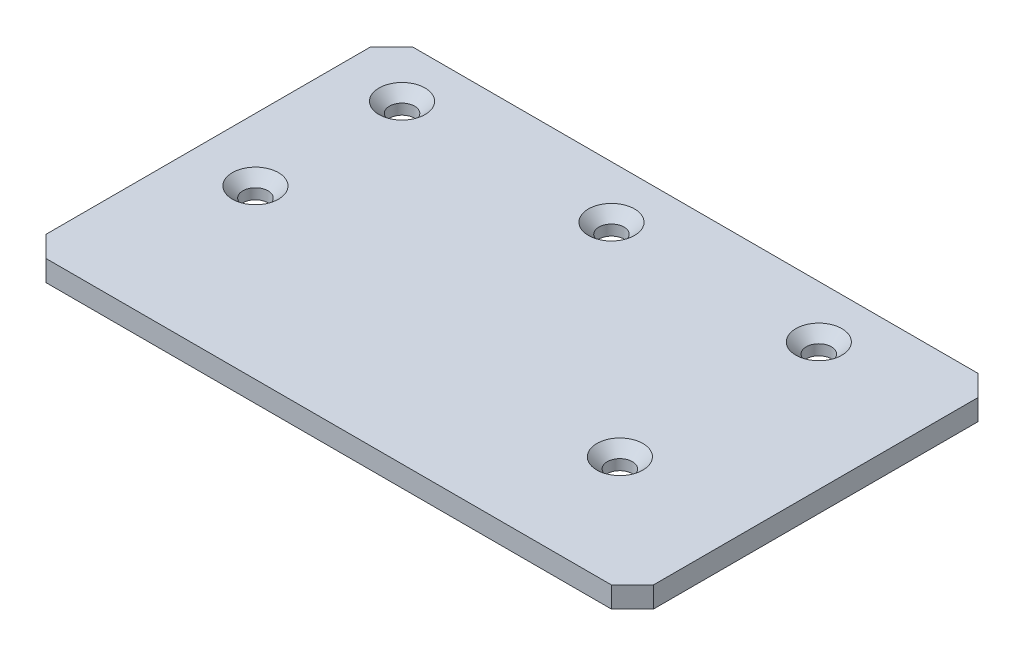
ISO-10303-21;
HEADER;
FILE_DESCRIPTION(('STEP AP214'),'2;1');
FILE_NAME('part.step','',(''),(''),'','','');
FILE_SCHEMA(('AUTOMOTIVE_DESIGN { 1 0 10303 214 1 1 1 1 }'));
ENDSEC;
DATA;
#1=APPLICATION_CONTEXT('core data for automotive mechanical design processes');
#2=APPLICATION_PROTOCOL_DEFINITION('international standard','automotive_design',2000,#1);
#3=PRODUCT_CONTEXT('',#1,'mechanical');
#4=PRODUCT('Part','Part','',(#3));
#5=PRODUCT_RELATED_PRODUCT_CATEGORY('part','',(#4));
#6=PRODUCT_DEFINITION_FORMATION('','',#4);
#7=PRODUCT_DEFINITION_CONTEXT('part definition',#1,'design');
#8=PRODUCT_DEFINITION('design','',#6,#7);
#9=PRODUCT_DEFINITION_SHAPE('','',#8);
#10=(LENGTH_UNIT() NAMED_UNIT(*) SI_UNIT(.MILLI.,.METRE.));
#11=(NAMED_UNIT(*) PLANE_ANGLE_UNIT() SI_UNIT($,.RADIAN.));
#12=(NAMED_UNIT(*) SI_UNIT($,.STERADIAN.) SOLID_ANGLE_UNIT());
#13=UNCERTAINTY_MEASURE_WITH_UNIT(LENGTH_MEASURE(1.E-05),#10,'distance_accuracy_value','');
#14=(GEOMETRIC_REPRESENTATION_CONTEXT(3) GLOBAL_UNCERTAINTY_ASSIGNED_CONTEXT((#13)) GLOBAL_UNIT_ASSIGNED_CONTEXT((#10,
#11,#12)) REPRESENTATION_CONTEXT('',''));
#15=CARTESIAN_POINT('',(0.,0.,0.));
#16=DIRECTION('',(0.,0.,1.));
#17=DIRECTION('',(1.,0.,0.));
#18=AXIS2_PLACEMENT_3D('',#15,#16,#17);
#19=CARTESIAN_POINT('',(29.,2.,17.5));
#20=DIRECTION('',(-1.,0.,0.));
#21=DIRECTION('',(0.,0.,1.));
#22=AXIS2_PLACEMENT_3D('',#19,#20,#21);
#23=PLANE('',#22);
#24=DIRECTION('',(0.,0.,-1.));
#25=VECTOR('',#24,1.);
#26=CARTESIAN_POINT('',(29.,2.,17.5));
#27=LINE('',#26,#25);
#28=CARTESIAN_POINT('',(29.,2.,15.5));
#29=VERTEX_POINT('',#28);
#30=CARTESIAN_POINT('',(29.,2.,-15.5));
#31=VERTEX_POINT('',#30);
#32=EDGE_CURVE('E149',#29,#31,#27,.T.);
#33=ORIENTED_EDGE('',*,*,#32,.F.);
#34=DIRECTION('',(0.,-1.,0.));
#35=VECTOR('',#34,1.);
#36=CARTESIAN_POINT('',(29.,2.,15.5));
#37=LINE('',#36,#35);
#38=CARTESIAN_POINT('',(29.,0.,15.5));
#39=VERTEX_POINT('',#38);
#40=EDGE_CURVE('E11',#29,#39,#37,.T.);
#41=ORIENTED_EDGE('',*,*,#40,.T.);
#42=DIRECTION('',(0.,0.,-1.));
#43=VECTOR('',#42,1.);
#44=CARTESIAN_POINT('',(29.,0.,17.5));
#45=LINE('',#44,#43);
#46=CARTESIAN_POINT('',(29.,0.,-15.5));
#47=VERTEX_POINT('',#46);
#48=EDGE_CURVE('E151',#39,#47,#45,.T.);
#49=ORIENTED_EDGE('',*,*,#48,.T.);
#50=DIRECTION('',(0.,1.,0.));
#51=VECTOR('',#50,1.);
#52=CARTESIAN_POINT('',(29.,2.,-15.5));
#53=LINE('',#52,#51);
#54=EDGE_CURVE('E57',#47,#31,#53,.T.);
#55=ORIENTED_EDGE('',*,*,#54,.T.);
#56=EDGE_LOOP('',(#33,#41,#49,#55));
#57=FACE_BOUND('',#56,.T.);
#58=ADVANCED_FACE('F47',(#57),#23,.F.);
#59=CARTESIAN_POINT('',(-29.,2.,-17.5));
#60=DIRECTION('',(0.,0.,1.));
#61=DIRECTION('',(1.,0.,0.));
#62=AXIS2_PLACEMENT_3D('',#59,#60,#61);
#63=PLANE('',#62);
#64=DIRECTION('',(-1.,0.,0.));
#65=VECTOR('',#64,1.);
#66=CARTESIAN_POINT('',(-29.,0.,-17.5));
#67=LINE('',#66,#65);
#68=CARTESIAN_POINT('',(27.,0.,-17.5));
#69=VERTEX_POINT('',#68);
#70=CARTESIAN_POINT('',(-27.,0.,-17.5));
#71=VERTEX_POINT('',#70);
#72=EDGE_CURVE('E145',#69,#71,#67,.T.);
#73=ORIENTED_EDGE('',*,*,#72,.T.);
#74=DIRECTION('',(0.,1.,0.));
#75=VECTOR('',#74,1.);
#76=CARTESIAN_POINT('',(-27.,2.,-17.5));
#77=LINE('',#76,#75);
#78=CARTESIAN_POINT('',(-27.,2.,-17.5));
#79=VERTEX_POINT('',#78);
#80=EDGE_CURVE('E121',#71,#79,#77,.T.);
#81=ORIENTED_EDGE('',*,*,#80,.T.);
#82=DIRECTION('',(-1.,0.,0.));
#83=VECTOR('',#82,1.);
#84=CARTESIAN_POINT('',(-29.,2.,-17.5));
#85=LINE('',#84,#83);
#86=CARTESIAN_POINT('',(27.,2.,-17.5));
#87=VERTEX_POINT('',#86);
#88=EDGE_CURVE('E201',#87,#79,#85,.T.);
#89=ORIENTED_EDGE('',*,*,#88,.F.);
#90=DIRECTION('',(0.,-1.,0.));
#91=VECTOR('',#90,1.);
#92=CARTESIAN_POINT('',(27.,2.,-17.5));
#93=LINE('',#92,#91);
#94=EDGE_CURVE('E127',#87,#69,#93,.T.);
#95=ORIENTED_EDGE('',*,*,#94,.T.);
#96=EDGE_LOOP('',(#73,#81,#89,#95));
#97=FACE_BOUND('',#96,.T.);
#98=ADVANCED_FACE('F205',(#97),#63,.F.);
#99=CARTESIAN_POINT('',(-29.,2.,17.5));
#100=DIRECTION('',(1.,0.,0.));
#101=DIRECTION('',(0.,0.,-1.));
#102=AXIS2_PLACEMENT_3D('',#99,#100,#101);
#103=PLANE('',#102);
#104=DIRECTION('',(0.,0.,1.));
#105=VECTOR('',#104,1.);
#106=CARTESIAN_POINT('',(-29.,2.,17.5));
#107=LINE('',#106,#105);
#108=CARTESIAN_POINT('',(-29.,2.,-15.5));
#109=VERTEX_POINT('',#108);
#110=CARTESIAN_POINT('',(-29.,2.,15.5));
#111=VERTEX_POINT('',#110);
#112=EDGE_CURVE('E136',#109,#111,#107,.T.);
#113=ORIENTED_EDGE('',*,*,#112,.F.);
#114=DIRECTION('',(0.,-1.,0.));
#115=VECTOR('',#114,1.);
#116=CARTESIAN_POINT('',(-29.,2.,-15.5));
#117=LINE('',#116,#115);
#118=CARTESIAN_POINT('',(-29.,0.,-15.5));
#119=VERTEX_POINT('',#118);
#120=EDGE_CURVE('E120',#109,#119,#117,.T.);
#121=ORIENTED_EDGE('',*,*,#120,.T.);
#122=DIRECTION('',(0.,0.,1.));
#123=VECTOR('',#122,1.);
#124=CARTESIAN_POINT('',(-29.,0.,17.5));
#125=LINE('',#124,#123);
#126=CARTESIAN_POINT('',(-29.,0.,15.5));
#127=VERTEX_POINT('',#126);
#128=EDGE_CURVE('E134',#119,#127,#125,.T.);
#129=ORIENTED_EDGE('',*,*,#128,.T.);
#130=DIRECTION('',(0.,1.,0.));
#131=VECTOR('',#130,1.);
#132=CARTESIAN_POINT('',(-29.,2.,15.5));
#133=LINE('',#132,#131);
#134=EDGE_CURVE('E139',#127,#111,#133,.T.);
#135=ORIENTED_EDGE('',*,*,#134,.T.);
#136=EDGE_LOOP('',(#113,#121,#129,#135));
#137=FACE_BOUND('',#136,.T.);
#138=ADVANCED_FACE('F133',(#137),#103,.F.);
#139=CARTESIAN_POINT('',(-29.,2.,17.5));
#140=DIRECTION('',(0.,0.,-1.));
#141=DIRECTION('',(-1.,0.,0.));
#142=AXIS2_PLACEMENT_3D('',#139,#140,#141);
#143=PLANE('',#142);
#144=DIRECTION('',(1.,0.,0.));
#145=VECTOR('',#144,1.);
#146=CARTESIAN_POINT('',(-29.,2.,17.5));
#147=LINE('',#146,#145);
#148=CARTESIAN_POINT('',(-27.,2.,17.5));
#149=VERTEX_POINT('',#148);
#150=CARTESIAN_POINT('',(27.,2.,17.5));
#151=VERTEX_POINT('',#150);
#152=EDGE_CURVE('E156',#149,#151,#147,.T.);
#153=ORIENTED_EDGE('',*,*,#152,.F.);
#154=DIRECTION('',(0.,-1.,0.));
#155=VECTOR('',#154,1.);
#156=CARTESIAN_POINT('',(-27.,2.,17.5));
#157=LINE('',#156,#155);
#158=CARTESIAN_POINT('',(-27.,0.,17.5));
#159=VERTEX_POINT('',#158);
#160=EDGE_CURVE('E183',#149,#159,#157,.T.);
#161=ORIENTED_EDGE('',*,*,#160,.T.);
#162=DIRECTION('',(1.,0.,0.));
#163=VECTOR('',#162,1.);
#164=CARTESIAN_POINT('',(-29.,0.,17.5));
#165=LINE('',#164,#163);
#166=CARTESIAN_POINT('',(27.,0.,17.5));
#167=VERTEX_POINT('',#166);
#168=EDGE_CURVE('E144',#159,#167,#165,.T.);
#169=ORIENTED_EDGE('',*,*,#168,.T.);
#170=DIRECTION('',(0.,1.,0.));
#171=VECTOR('',#170,1.);
#172=CARTESIAN_POINT('',(27.,2.,17.5));
#173=LINE('',#172,#171);
#174=EDGE_CURVE('E64',#167,#151,#173,.T.);
#175=ORIENTED_EDGE('',*,*,#174,.T.);
#176=EDGE_LOOP('',(#153,#161,#169,#175));
#177=FACE_BOUND('',#176,.T.);
#178=ADVANCED_FACE('F279',(#177),#143,.F.);
#179=CARTESIAN_POINT('',(0.,2.,0.));
#180=DIRECTION('',(0.,-1.,0.));
#181=DIRECTION('',(0.,0.,-1.));
#182=AXIS2_PLACEMENT_3D('',#179,#180,#181);
#183=PLANE('',#182);
#184=CARTESIAN_POINT('',(-23.,2.,-12.5));
#185=DIRECTION('',(0.,1.,0.));
#186=DIRECTION('',(0.,0.,1.));
#187=AXIS2_PLACEMENT_3D('',#184,#185,#186);
#188=CIRCLE('',#187,2.2);
#189=CARTESIAN_POINT('',(-23.,2.,-10.3));
#190=VERTEX_POINT('',#189);
#191=EDGE_CURVE('E270',#190,#190,#188,.T.);
#192=ORIENTED_EDGE('',*,*,#191,.F.);
#193=EDGE_LOOP('',(#192));
#194=FACE_BOUND('',#193,.T.);
#195=CARTESIAN_POINT('',(-3.,2.,-12.5));
#196=DIRECTION('',(0.,1.,0.));
#197=DIRECTION('',(0.,0.,1.));
#198=AXIS2_PLACEMENT_3D('',#195,#196,#197);
#199=CIRCLE('',#198,2.2);
#200=CARTESIAN_POINT('',(-3.,2.,-10.3));
#201=VERTEX_POINT('',#200);
#202=EDGE_CURVE('E258',#201,#201,#199,.T.);
#203=ORIENTED_EDGE('',*,*,#202,.F.);
#204=EDGE_LOOP('',(#203));
#205=FACE_BOUND('',#204,.T.);
#206=CARTESIAN_POINT('',(16.8,2.,-12.5));
#207=DIRECTION('',(0.,1.,0.));
#208=DIRECTION('',(0.,0.,1.));
#209=AXIS2_PLACEMENT_3D('',#206,#207,#208);
#210=CIRCLE('',#209,2.2);
#211=CARTESIAN_POINT('',(16.8,2.,-10.3));
#212=VERTEX_POINT('',#211);
#213=EDGE_CURVE('E246',#212,#212,#210,.T.);
#214=ORIENTED_EDGE('',*,*,#213,.F.);
#215=EDGE_LOOP('',(#214));
#216=FACE_BOUND('',#215,.T.);
#217=CARTESIAN_POINT('',(16.8,2.,6.5));
#218=DIRECTION('',(0.,1.,0.));
#219=DIRECTION('',(0.,0.,1.));
#220=AXIS2_PLACEMENT_3D('',#217,#218,#219);
#221=CIRCLE('',#220,2.2);
#222=CARTESIAN_POINT('',(16.8,2.,8.7));
#223=VERTEX_POINT('',#222);
#224=EDGE_CURVE('E234',#223,#223,#221,.T.);
#225=ORIENTED_EDGE('',*,*,#224,.F.);
#226=EDGE_LOOP('',(#225));
#227=FACE_BOUND('',#226,.T.);
#228=CARTESIAN_POINT('',(-23.,2.,1.5));
#229=DIRECTION('',(0.,1.,0.));
#230=DIRECTION('',(0.,0.,1.));
#231=AXIS2_PLACEMENT_3D('',#228,#229,#230);
#232=CIRCLE('',#231,2.2);
#233=CARTESIAN_POINT('',(-23.,2.,3.7));
#234=VERTEX_POINT('',#233);
#235=EDGE_CURVE('E222',#234,#234,#232,.T.);
#236=ORIENTED_EDGE('',*,*,#235,.F.);
#237=EDGE_LOOP('',(#236));
#238=FACE_BOUND('',#237,.T.);
#239=ORIENTED_EDGE('',*,*,#88,.T.);
#240=DIRECTION('',(0.707106781186549,0.,-0.707106781186546));
#241=VECTOR('',#240,1.);
#242=CARTESIAN_POINT('',(-29.,2.,-15.5));
#243=LINE('',#242,#241);
#244=EDGE_CURVE('E178',#79,#109,#243,.F.);
#245=ORIENTED_EDGE('',*,*,#244,.T.);
#246=ORIENTED_EDGE('',*,*,#112,.T.);
#247=DIRECTION('',(-0.707106781186548,0.,-0.707106781186548));
#248=VECTOR('',#247,1.);
#249=CARTESIAN_POINT('',(-27.,2.,17.5));
#250=LINE('',#249,#248);
#251=EDGE_CURVE('E71',#111,#149,#250,.F.);
#252=ORIENTED_EDGE('',*,*,#251,.T.);
#253=ORIENTED_EDGE('',*,*,#152,.T.);
#254=DIRECTION('',(-0.707106781186549,0.,0.707106781186546));
#255=VECTOR('',#254,1.);
#256=CARTESIAN_POINT('',(29.,2.,15.5));
#257=LINE('',#256,#255);
#258=EDGE_CURVE('E173',#151,#29,#257,.F.);
#259=ORIENTED_EDGE('',*,*,#258,.T.);
#260=ORIENTED_EDGE('',*,*,#32,.T.);
#261=DIRECTION('',(0.707106781186546,0.,0.707106781186549));
#262=VECTOR('',#261,1.);
#263=CARTESIAN_POINT('',(27.,2.,-17.5));
#264=LINE('',#263,#262);
#265=EDGE_CURVE('E170',#31,#87,#264,.F.);
#266=ORIENTED_EDGE('',*,*,#265,.T.);
#267=EDGE_LOOP('',(#239,#245,#246,#252,#253,#259,#260,#266));
#268=FACE_BOUND('',#267,.T.);
#269=ADVANCED_FACE('F197',(#194,#205,#216,#227,#238,#268),#183,.F.);
#270=CARTESIAN_POINT('',(0.,0.,0.));
#271=DIRECTION('',(0.,-1.,0.));
#272=DIRECTION('',(0.,0.,-1.));
#273=AXIS2_PLACEMENT_3D('',#270,#271,#272);
#274=PLANE('',#273);
#275=CARTESIAN_POINT('',(-23.,0.,-12.5));
#276=DIRECTION('',(0.,1.,0.));
#277=DIRECTION('',(0.,0.,1.));
#278=AXIS2_PLACEMENT_3D('',#275,#276,#277);
#279=CIRCLE('',#278,1.2);
#280=CARTESIAN_POINT('',(-23.,0.,-11.3));
#281=VERTEX_POINT('',#280);
#282=EDGE_CURVE('E262',#281,#281,#279,.T.);
#283=ORIENTED_EDGE('',*,*,#282,.T.);
#284=EDGE_LOOP('',(#283));
#285=FACE_BOUND('',#284,.T.);
#286=CARTESIAN_POINT('',(-3.,0.,-12.5));
#287=DIRECTION('',(0.,1.,0.));
#288=DIRECTION('',(0.,0.,1.));
#289=AXIS2_PLACEMENT_3D('',#286,#287,#288);
#290=CIRCLE('',#289,1.2);
#291=CARTESIAN_POINT('',(-3.,0.,-11.3));
#292=VERTEX_POINT('',#291);
#293=EDGE_CURVE('E250',#292,#292,#290,.T.);
#294=ORIENTED_EDGE('',*,*,#293,.T.);
#295=EDGE_LOOP('',(#294));
#296=FACE_BOUND('',#295,.T.);
#297=CARTESIAN_POINT('',(16.8,0.,-12.5));
#298=DIRECTION('',(0.,1.,0.));
#299=DIRECTION('',(0.,0.,1.));
#300=AXIS2_PLACEMENT_3D('',#297,#298,#299);
#301=CIRCLE('',#300,1.2);
#302=CARTESIAN_POINT('',(16.8,0.,-11.3));
#303=VERTEX_POINT('',#302);
#304=EDGE_CURVE('E238',#303,#303,#301,.T.);
#305=ORIENTED_EDGE('',*,*,#304,.T.);
#306=EDGE_LOOP('',(#305));
#307=FACE_BOUND('',#306,.T.);
#308=CARTESIAN_POINT('',(16.8,0.,6.5));
#309=DIRECTION('',(0.,1.,0.));
#310=DIRECTION('',(0.,0.,1.));
#311=AXIS2_PLACEMENT_3D('',#308,#309,#310);
#312=CIRCLE('',#311,1.2);
#313=CARTESIAN_POINT('',(16.8,0.,7.7));
#314=VERTEX_POINT('',#313);
#315=EDGE_CURVE('E226',#314,#314,#312,.T.);
#316=ORIENTED_EDGE('',*,*,#315,.T.);
#317=EDGE_LOOP('',(#316));
#318=FACE_BOUND('',#317,.T.);
#319=CARTESIAN_POINT('',(-23.,0.,1.5));
#320=DIRECTION('',(0.,1.,0.));
#321=DIRECTION('',(0.,0.,1.));
#322=AXIS2_PLACEMENT_3D('',#319,#320,#321);
#323=CIRCLE('',#322,1.2);
#324=CARTESIAN_POINT('',(-23.,0.,2.7));
#325=VERTEX_POINT('',#324);
#326=EDGE_CURVE('E207',#325,#325,#323,.T.);
#327=ORIENTED_EDGE('',*,*,#326,.T.);
#328=EDGE_LOOP('',(#327));
#329=FACE_BOUND('',#328,.T.);
#330=ORIENTED_EDGE('',*,*,#128,.F.);
#331=DIRECTION('',(-0.707106781186549,0.,0.707106781186546));
#332=VECTOR('',#331,1.);
#333=CARTESIAN_POINT('',(-22.2499999999999,0.,-22.25));
#334=LINE('',#333,#332);
#335=EDGE_CURVE('E116',#119,#71,#334,.F.);
#336=ORIENTED_EDGE('',*,*,#335,.T.);
#337=ORIENTED_EDGE('',*,*,#72,.F.);
#338=DIRECTION('',(-0.707106781186546,0.,-0.707106781186549));
#339=VECTOR('',#338,1.);
#340=CARTESIAN_POINT('',(22.25,0.,-22.25));
#341=LINE('',#340,#339);
#342=EDGE_CURVE('E138',#69,#47,#341,.F.);
#343=ORIENTED_EDGE('',*,*,#342,.T.);
#344=ORIENTED_EDGE('',*,*,#48,.F.);
#345=DIRECTION('',(0.707106781186549,0.,-0.707106781186546));
#346=VECTOR('',#345,1.);
#347=CARTESIAN_POINT('',(22.2499999999999,0.,22.25));
#348=LINE('',#347,#346);
#349=EDGE_CURVE('E160',#39,#167,#348,.F.);
#350=ORIENTED_EDGE('',*,*,#349,.T.);
#351=ORIENTED_EDGE('',*,*,#168,.F.);
#352=DIRECTION('',(0.707106781186548,0.,0.707106781186548));
#353=VECTOR('',#352,1.);
#354=CARTESIAN_POINT('',(-22.25,0.,22.25));
#355=LINE('',#354,#353);
#356=EDGE_CURVE('E128',#159,#127,#355,.F.);
#357=ORIENTED_EDGE('',*,*,#356,.T.);
#358=EDGE_LOOP('',(#330,#336,#337,#343,#344,#350,#351,#357));
#359=FACE_BOUND('',#358,.T.);
#360=ADVANCED_FACE('F141',(#285,#296,#307,#318,#329,#359),#274,.T.);
#361=CARTESIAN_POINT('',(-23.,2.,1.5));
#362=DIRECTION('',(0.,1.,0.));
#363=DIRECTION('',(0.,0.,1.));
#364=AXIS2_PLACEMENT_3D('',#361,#362,#363);
#365=CYLINDRICAL_SURFACE('',#364,1.2);
#366=ORIENTED_EDGE('',*,*,#326,.F.);
#367=EDGE_LOOP('',(#366));
#368=FACE_BOUND('',#367,.T.);
#369=CARTESIAN_POINT('',(-23.,0.999999999999999,1.5));
#370=DIRECTION('',(0.,1.,0.));
#371=DIRECTION('',(0.,0.,1.));
#372=AXIS2_PLACEMENT_3D('',#369,#370,#371);
#373=CIRCLE('',#372,1.2);
#374=CARTESIAN_POINT('',(-23.,0.999999999999999,2.7));
#375=VERTEX_POINT('',#374);
#376=EDGE_CURVE('E210',#375,#375,#373,.T.);
#377=ORIENTED_EDGE('',*,*,#376,.T.);
#378=EDGE_LOOP('',(#377));
#379=FACE_BOUND('',#378,.T.);
#380=ADVANCED_FACE('F292',(#368,#379),#365,.F.);
#381=CARTESIAN_POINT('',(-23.,2.,1.5));
#382=DIRECTION('',(0.,1.,0.));
#383=DIRECTION('',(0.,0.,1.));
#384=AXIS2_PLACEMENT_3D('',#381,#382,#383);
#385=CONICAL_SURFACE('',#384,2.2,0.785398163397448);
#386=ORIENTED_EDGE('',*,*,#376,.F.);
#387=EDGE_LOOP('',(#386));
#388=FACE_BOUND('',#387,.T.);
#389=ORIENTED_EDGE('',*,*,#235,.T.);
#390=EDGE_LOOP('',(#389));
#391=FACE_BOUND('',#390,.T.);
#392=ADVANCED_FACE('F289',(#388,#391),#385,.F.);
#393=CARTESIAN_POINT('',(16.8,2.,6.5));
#394=DIRECTION('',(0.,1.,0.));
#395=DIRECTION('',(0.,0.,1.));
#396=AXIS2_PLACEMENT_3D('',#393,#394,#395);
#397=CYLINDRICAL_SURFACE('',#396,1.2);
#398=ORIENTED_EDGE('',*,*,#315,.F.);
#399=EDGE_LOOP('',(#398));
#400=FACE_BOUND('',#399,.T.);
#401=CARTESIAN_POINT('',(16.8,0.999999999999999,6.5));
#402=DIRECTION('',(0.,1.,0.));
#403=DIRECTION('',(0.,0.,1.));
#404=AXIS2_PLACEMENT_3D('',#401,#402,#403);
#405=CIRCLE('',#404,1.2);
#406=CARTESIAN_POINT('',(16.8,0.999999999999999,7.7));
#407=VERTEX_POINT('',#406);
#408=EDGE_CURVE('E230',#407,#407,#405,.T.);
#409=ORIENTED_EDGE('',*,*,#408,.T.);
#410=EDGE_LOOP('',(#409));
#411=FACE_BOUND('',#410,.T.);
#412=ADVANCED_FACE('F291',(#400,#411),#397,.F.);
#413=CARTESIAN_POINT('',(16.8,2.,6.5));
#414=DIRECTION('',(0.,1.,0.));
#415=DIRECTION('',(0.,0.,1.));
#416=AXIS2_PLACEMENT_3D('',#413,#414,#415);
#417=CONICAL_SURFACE('',#416,2.2,0.785398163397448);
#418=ORIENTED_EDGE('',*,*,#408,.F.);
#419=EDGE_LOOP('',(#418));
#420=FACE_BOUND('',#419,.T.);
#421=ORIENTED_EDGE('',*,*,#224,.T.);
#422=EDGE_LOOP('',(#421));
#423=FACE_BOUND('',#422,.T.);
#424=ADVANCED_FACE('F299',(#420,#423),#417,.F.);
#425=CARTESIAN_POINT('',(16.8,2.,-12.5));
#426=DIRECTION('',(0.,1.,0.));
#427=DIRECTION('',(0.,0.,1.));
#428=AXIS2_PLACEMENT_3D('',#425,#426,#427);
#429=CYLINDRICAL_SURFACE('',#428,1.2);
#430=ORIENTED_EDGE('',*,*,#304,.F.);
#431=EDGE_LOOP('',(#430));
#432=FACE_BOUND('',#431,.T.);
#433=CARTESIAN_POINT('',(16.8,0.999999999999999,-12.5));
#434=DIRECTION('',(0.,1.,0.));
#435=DIRECTION('',(0.,0.,1.));
#436=AXIS2_PLACEMENT_3D('',#433,#434,#435);
#437=CIRCLE('',#436,1.2);
#438=CARTESIAN_POINT('',(16.8,0.999999999999999,-11.3));
#439=VERTEX_POINT('',#438);
#440=EDGE_CURVE('E242',#439,#439,#437,.T.);
#441=ORIENTED_EDGE('',*,*,#440,.T.);
#442=EDGE_LOOP('',(#441));
#443=FACE_BOUND('',#442,.T.);
#444=ADVANCED_FACE('F402',(#432,#443),#429,.F.);
#445=CARTESIAN_POINT('',(16.8,2.,-12.5));
#446=DIRECTION('',(0.,1.,0.));
#447=DIRECTION('',(0.,0.,1.));
#448=AXIS2_PLACEMENT_3D('',#445,#446,#447);
#449=CONICAL_SURFACE('',#448,2.2,0.785398163397448);
#450=ORIENTED_EDGE('',*,*,#440,.F.);
#451=EDGE_LOOP('',(#450));
#452=FACE_BOUND('',#451,.T.);
#453=ORIENTED_EDGE('',*,*,#213,.T.);
#454=EDGE_LOOP('',(#453));
#455=FACE_BOUND('',#454,.T.);
#456=ADVANCED_FACE('F392',(#452,#455),#449,.F.);
#457=CARTESIAN_POINT('',(-3.,2.,-12.5));
#458=DIRECTION('',(0.,1.,0.));
#459=DIRECTION('',(0.,0.,1.));
#460=AXIS2_PLACEMENT_3D('',#457,#458,#459);
#461=CYLINDRICAL_SURFACE('',#460,1.2);
#462=ORIENTED_EDGE('',*,*,#293,.F.);
#463=EDGE_LOOP('',(#462));
#464=FACE_BOUND('',#463,.T.);
#465=CARTESIAN_POINT('',(-3.,0.999999999999999,-12.5));
#466=DIRECTION('',(0.,1.,0.));
#467=DIRECTION('',(0.,0.,1.));
#468=AXIS2_PLACEMENT_3D('',#465,#466,#467);
#469=CIRCLE('',#468,1.2);
#470=CARTESIAN_POINT('',(-3.,0.999999999999999,-11.3));
#471=VERTEX_POINT('',#470);
#472=EDGE_CURVE('E254',#471,#471,#469,.T.);
#473=ORIENTED_EDGE('',*,*,#472,.T.);
#474=EDGE_LOOP('',(#473));
#475=FACE_BOUND('',#474,.T.);
#476=ADVANCED_FACE('F382',(#464,#475),#461,.F.);
#477=CARTESIAN_POINT('',(-3.,2.,-12.5));
#478=DIRECTION('',(0.,1.,0.));
#479=DIRECTION('',(0.,0.,1.));
#480=AXIS2_PLACEMENT_3D('',#477,#478,#479);
#481=CONICAL_SURFACE('',#480,2.2,0.785398163397448);
#482=ORIENTED_EDGE('',*,*,#472,.F.);
#483=EDGE_LOOP('',(#482));
#484=FACE_BOUND('',#483,.T.);
#485=ORIENTED_EDGE('',*,*,#202,.T.);
#486=EDGE_LOOP('',(#485));
#487=FACE_BOUND('',#486,.T.);
#488=ADVANCED_FACE('F372',(#484,#487),#481,.F.);
#489=CARTESIAN_POINT('',(-23.,2.,-12.5));
#490=DIRECTION('',(0.,1.,0.));
#491=DIRECTION('',(0.,0.,1.));
#492=AXIS2_PLACEMENT_3D('',#489,#490,#491);
#493=CYLINDRICAL_SURFACE('',#492,1.2);
#494=ORIENTED_EDGE('',*,*,#282,.F.);
#495=EDGE_LOOP('',(#494));
#496=FACE_BOUND('',#495,.T.);
#497=CARTESIAN_POINT('',(-23.,0.999999999999999,-12.5));
#498=DIRECTION('',(0.,1.,0.));
#499=DIRECTION('',(0.,0.,1.));
#500=AXIS2_PLACEMENT_3D('',#497,#498,#499);
#501=CIRCLE('',#500,1.2);
#502=CARTESIAN_POINT('',(-23.,0.999999999999999,-11.3));
#503=VERTEX_POINT('',#502);
#504=EDGE_CURVE('E266',#503,#503,#501,.T.);
#505=ORIENTED_EDGE('',*,*,#504,.T.);
#506=EDGE_LOOP('',(#505));
#507=FACE_BOUND('',#506,.T.);
#508=ADVANCED_FACE('F362',(#496,#507),#493,.F.);
#509=CARTESIAN_POINT('',(-23.,2.,-12.5));
#510=DIRECTION('',(0.,1.,0.));
#511=DIRECTION('',(0.,0.,1.));
#512=AXIS2_PLACEMENT_3D('',#509,#510,#511);
#513=CONICAL_SURFACE('',#512,2.2,0.785398163397448);
#514=ORIENTED_EDGE('',*,*,#504,.F.);
#515=EDGE_LOOP('',(#514));
#516=FACE_BOUND('',#515,.T.);
#517=ORIENTED_EDGE('',*,*,#191,.T.);
#518=EDGE_LOOP('',(#517));
#519=FACE_BOUND('',#518,.T.);
#520=ADVANCED_FACE('F275',(#516,#519),#513,.F.);
#521=CARTESIAN_POINT('',(-29.,2.,-15.5));
#522=DIRECTION('',(0.707106781186546,0.,0.707106781186549));
#523=DIRECTION('',(0.,-1.,0.));
#524=AXIS2_PLACEMENT_3D('',#521,#522,#523);
#525=PLANE('',#524);
#526=ORIENTED_EDGE('',*,*,#244,.F.);
#527=ORIENTED_EDGE('',*,*,#80,.F.);
#528=ORIENTED_EDGE('',*,*,#335,.F.);
#529=ORIENTED_EDGE('',*,*,#120,.F.);
#530=EDGE_LOOP('',(#526,#527,#528,#529));
#531=FACE_BOUND('',#530,.T.);
#532=ADVANCED_FACE('F119',(#531),#525,.F.);
#533=CARTESIAN_POINT('',(-27.,2.,17.5));
#534=DIRECTION('',(0.707106781186547,0.,-0.707106781186547));
#535=DIRECTION('',(0.,-1.,0.));
#536=AXIS2_PLACEMENT_3D('',#533,#534,#535);
#537=PLANE('',#536);
#538=ORIENTED_EDGE('',*,*,#251,.F.);
#539=ORIENTED_EDGE('',*,*,#134,.F.);
#540=ORIENTED_EDGE('',*,*,#356,.F.);
#541=ORIENTED_EDGE('',*,*,#160,.F.);
#542=EDGE_LOOP('',(#538,#539,#540,#541));
#543=FACE_BOUND('',#542,.T.);
#544=ADVANCED_FACE('F320',(#543),#537,.F.);
#545=CARTESIAN_POINT('',(29.,2.,15.5));
#546=DIRECTION('',(-0.707106781186546,0.,-0.707106781186549));
#547=DIRECTION('',(0.,-1.,0.));
#548=AXIS2_PLACEMENT_3D('',#545,#546,#547);
#549=PLANE('',#548);
#550=ORIENTED_EDGE('',*,*,#258,.F.);
#551=ORIENTED_EDGE('',*,*,#174,.F.);
#552=ORIENTED_EDGE('',*,*,#349,.F.);
#553=ORIENTED_EDGE('',*,*,#40,.F.);
#554=EDGE_LOOP('',(#550,#551,#552,#553));
#555=FACE_BOUND('',#554,.T.);
#556=ADVANCED_FACE('F325',(#555),#549,.F.);
#557=CARTESIAN_POINT('',(27.,2.,-17.5));
#558=DIRECTION('',(-0.707106781186549,0.,0.707106781186546));
#559=DIRECTION('',(0.,-1.,0.));
#560=AXIS2_PLACEMENT_3D('',#557,#558,#559);
#561=PLANE('',#560);
#562=ORIENTED_EDGE('',*,*,#265,.F.);
#563=ORIENTED_EDGE('',*,*,#54,.F.);
#564=ORIENTED_EDGE('',*,*,#342,.F.);
#565=ORIENTED_EDGE('',*,*,#94,.F.);
#566=EDGE_LOOP('',(#562,#563,#564,#565));
#567=FACE_BOUND('',#566,.T.);
#568=ADVANCED_FACE('F50',(#567),#561,.F.);
#569=CLOSED_SHELL('',(#58,#98,#138,#178,#269,#360,#380,#392,#412,#424,#444,#456,#476,#488,#508,
#520,#532,#544,#556,#568));
#570=MANIFOLD_SOLID_BREP('B2',#569);
#571=ADVANCED_BREP_SHAPE_REPRESENTATION('',(#18,#570),#14);
#572=SHAPE_DEFINITION_REPRESENTATION(#9,#571);
ENDSEC;
END-ISO-10303-21;
